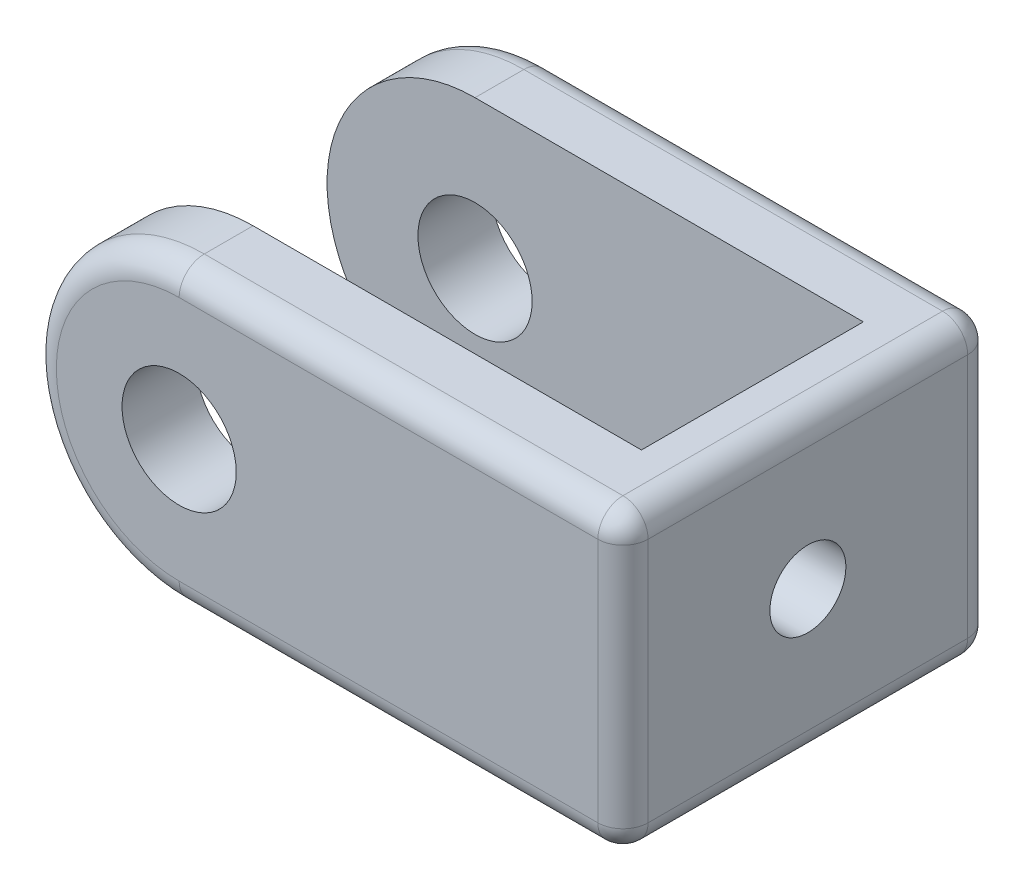
ISO-10303-21;
HEADER;
FILE_DESCRIPTION(('STEP AP214'),'2;1');
FILE_NAME('part.step','',(''),(''),'','','');
FILE_SCHEMA(('AUTOMOTIVE_DESIGN { 1 0 10303 214 1 1 1 1 }'));
ENDSEC;
DATA;
#1=APPLICATION_CONTEXT('core data for automotive mechanical design processes');
#2=APPLICATION_PROTOCOL_DEFINITION('international standard','automotive_design',2000,#1);
#3=PRODUCT_CONTEXT('',#1,'mechanical');
#4=PRODUCT('Part','Part','',(#3));
#5=PRODUCT_RELATED_PRODUCT_CATEGORY('part','',(#4));
#6=PRODUCT_DEFINITION_FORMATION('','',#4);
#7=PRODUCT_DEFINITION_CONTEXT('part definition',#1,'design');
#8=PRODUCT_DEFINITION('design','',#6,#7);
#9=PRODUCT_DEFINITION_SHAPE('','',#8);
#10=(LENGTH_UNIT() NAMED_UNIT(*) SI_UNIT(.MILLI.,.METRE.));
#11=(NAMED_UNIT(*) PLANE_ANGLE_UNIT() SI_UNIT($,.RADIAN.));
#12=(NAMED_UNIT(*) SI_UNIT($,.STERADIAN.) SOLID_ANGLE_UNIT());
#13=UNCERTAINTY_MEASURE_WITH_UNIT(LENGTH_MEASURE(1.E-05),#10,'distance_accuracy_value','');
#14=(GEOMETRIC_REPRESENTATION_CONTEXT(3) GLOBAL_UNCERTAINTY_ASSIGNED_CONTEXT((#13)) GLOBAL_UNIT_ASSIGNED_CONTEXT((#10,
#11,#12)) REPRESENTATION_CONTEXT('',''));
#15=CARTESIAN_POINT('',(0.,0.,0.));
#16=DIRECTION('',(0.,0.,1.));
#17=DIRECTION('',(1.,0.,0.));
#18=AXIS2_PLACEMENT_3D('',#15,#16,#17);
#19=CARTESIAN_POINT('',(-19.05,0.,15.875));
#20=DIRECTION('',(0.,0.,-1.));
#21=DIRECTION('',(-1.,0.,0.));
#22=AXIS2_PLACEMENT_3D('',#19,#20,#21);
#23=CYLINDRICAL_SURFACE('',#22,12.7);
#24=DIRECTION('',(0.,0.,-1.));
#25=VECTOR('',#24,1.);
#26=CARTESIAN_POINT('',(-19.05,12.7,15.875));
#27=LINE('',#26,#25);
#28=CARTESIAN_POINT('',(-19.05,12.7,-9.525));
#29=VERTEX_POINT('',#28);
#30=CARTESIAN_POINT('',(-19.05,12.7,-13.716));
#31=VERTEX_POINT('',#30);
#32=EDGE_CURVE('E185',#29,#31,#27,.T.);
#33=ORIENTED_EDGE('',*,*,#32,.T.);
#34=CARTESIAN_POINT('',(-19.05,0.,-13.716));
#35=DIRECTION('',(0.,0.,-1.));
#36=DIRECTION('',(-1.,0.,0.));
#37=AXIS2_PLACEMENT_3D('',#34,#35,#36);
#38=CIRCLE('',#37,12.7);
#39=CARTESIAN_POINT('',(-19.05,-12.7,-13.716));
#40=VERTEX_POINT('',#39);
#41=EDGE_CURVE('E212',#31,#40,#38,.F.);
#42=ORIENTED_EDGE('',*,*,#41,.T.);
#43=DIRECTION('',(0.,0.,-1.));
#44=VECTOR('',#43,1.);
#45=CARTESIAN_POINT('',(-19.05,-12.7,15.875));
#46=LINE('',#45,#44);
#47=CARTESIAN_POINT('',(-19.05,-12.7,-9.525));
#48=VERTEX_POINT('',#47);
#49=EDGE_CURVE('E190',#48,#40,#46,.T.);
#50=ORIENTED_EDGE('',*,*,#49,.F.);
#51=CARTESIAN_POINT('',(-19.05,0.,-9.525));
#52=DIRECTION('',(0.,0.,-1.));
#53=DIRECTION('',(-1.,0.,0.));
#54=AXIS2_PLACEMENT_3D('',#51,#52,#53);
#55=CIRCLE('',#54,12.7);
#56=EDGE_CURVE('E179',#48,#29,#55,.T.);
#57=ORIENTED_EDGE('',*,*,#56,.T.);
#58=EDGE_LOOP('',(#33,#42,#50,#57));
#59=FACE_BOUND('',#58,.T.);
#60=ADVANCED_FACE('F35',(#59),#23,.T.);
#61=CARTESIAN_POINT('',(-19.05,0.,-15.875));
#62=DIRECTION('',(0.,0.,1.));
#63=DIRECTION('',(1.,0.,0.));
#64=AXIS2_PLACEMENT_3D('',#61,#62,#63);
#65=CYLINDRICAL_SURFACE('',#64,4.9022);
#66=CARTESIAN_POINT('',(-19.05,0.,-9.525));
#67=DIRECTION('',(0.,0.,-1.));
#68=DIRECTION('',(-1.,0.,0.));
#69=AXIS2_PLACEMENT_3D('',#66,#67,#68);
#70=CIRCLE('',#69,4.9022);
#71=CARTESIAN_POINT('',(-23.9522,0.,-9.525));
#72=VERTEX_POINT('',#71);
#73=EDGE_CURVE('E178',#72,#72,#70,.F.);
#74=ORIENTED_EDGE('',*,*,#73,.T.);
#75=EDGE_LOOP('',(#74));
#76=FACE_BOUND('',#75,.T.);
#77=CARTESIAN_POINT('',(-19.05,0.,-15.875));
#78=DIRECTION('',(0.,0.,1.));
#79=DIRECTION('',(1.,0.,0.));
#80=AXIS2_PLACEMENT_3D('',#77,#78,#79);
#81=CIRCLE('',#80,4.9022);
#82=CARTESIAN_POINT('',(-14.1478,0.,-15.875));
#83=VERTEX_POINT('',#82);
#84=EDGE_CURVE('E182',#83,#83,#81,.T.);
#85=ORIENTED_EDGE('',*,*,#84,.F.);
#86=EDGE_LOOP('',(#85));
#87=FACE_BOUND('',#86,.T.);
#88=ADVANCED_FACE('F304',(#76,#87),#65,.F.);
#89=CARTESIAN_POINT('',(-19.05,-12.7,13.716));
#90=VERTEX_POINT('',#89);
#91=CARTESIAN_POINT('',(-19.05,-12.7,9.525));
#92=VERTEX_POINT('',#91);
#93=EDGE_CURVE('E160',#90,#92,#46,.T.);
#94=ORIENTED_EDGE('',*,*,#93,.F.);
#95=CARTESIAN_POINT('',(-19.05,0.,13.716));
#96=DIRECTION('',(0.,0.,-1.));
#97=DIRECTION('',(-1.,0.,0.));
#98=AXIS2_PLACEMENT_3D('',#95,#96,#97);
#99=CIRCLE('',#98,12.7);
#100=CARTESIAN_POINT('',(-19.05,12.7,13.716));
#101=VERTEX_POINT('',#100);
#102=EDGE_CURVE('E223',#90,#101,#99,.T.);
#103=ORIENTED_EDGE('',*,*,#102,.T.);
#104=CARTESIAN_POINT('',(-19.05,12.7,9.525));
#105=VERTEX_POINT('',#104);
#106=EDGE_CURVE('E188',#101,#105,#27,.T.);
#107=ORIENTED_EDGE('',*,*,#106,.T.);
#108=CARTESIAN_POINT('',(-19.05,0.,9.525));
#109=DIRECTION('',(0.,0.,1.));
#110=DIRECTION('',(1.,0.,0.));
#111=AXIS2_PLACEMENT_3D('',#108,#109,#110);
#112=CIRCLE('',#111,12.7);
#113=EDGE_CURVE('E176',#105,#92,#112,.T.);
#114=ORIENTED_EDGE('',*,*,#113,.T.);
#115=EDGE_LOOP('',(#94,#103,#107,#114));
#116=FACE_BOUND('',#115,.T.);
#117=ADVANCED_FACE('F307',(#116),#23,.T.);
#118=CARTESIAN_POINT('',(19.05,-12.7,15.875));
#119=DIRECTION('',(0.,1.,0.));
#120=DIRECTION('',(0.,0.,1.));
#121=AXIS2_PLACEMENT_3D('',#118,#119,#120);
#122=PLANE('',#121);
#123=ORIENTED_EDGE('',*,*,#49,.T.);
#124=DIRECTION('',(1.,0.,0.));
#125=VECTOR('',#124,1.);
#126=CARTESIAN_POINT('',(19.05,-12.7,-13.716));
#127=LINE('',#126,#125);
#128=CARTESIAN_POINT('',(16.891,-12.7,-13.716));
#129=VERTEX_POINT('',#128);
#130=EDGE_CURVE('E200',#40,#129,#127,.T.);
#131=ORIENTED_EDGE('',*,*,#130,.T.);
#132=DIRECTION('',(0.,0.,-1.));
#133=VECTOR('',#132,1.);
#134=CARTESIAN_POINT('',(16.891,-12.7,15.875));
#135=LINE('',#134,#133);
#136=CARTESIAN_POINT('',(16.891,-12.7,13.716));
#137=VERTEX_POINT('',#136);
#138=EDGE_CURVE('E192',#129,#137,#135,.F.);
#139=ORIENTED_EDGE('',*,*,#138,.T.);
#140=DIRECTION('',(1.,0.,0.));
#141=VECTOR('',#140,1.);
#142=CARTESIAN_POINT('',(19.05,-12.7,13.716));
#143=LINE('',#142,#141);
#144=EDGE_CURVE('E198',#137,#90,#143,.F.);
#145=ORIENTED_EDGE('',*,*,#144,.T.);
#146=ORIENTED_EDGE('',*,*,#93,.T.);
#147=DIRECTION('',(1.,0.,0.));
#148=VECTOR('',#147,1.);
#149=CARTESIAN_POINT('',(-31.75,-12.7,9.525));
#150=LINE('',#149,#148);
#151=CARTESIAN_POINT('',(14.2875,-12.7,9.525));
#152=VERTEX_POINT('',#151);
#153=EDGE_CURVE('E141',#92,#152,#150,.T.);
#154=ORIENTED_EDGE('',*,*,#153,.T.);
#155=DIRECTION('',(0.,0.,-1.));
#156=VECTOR('',#155,1.);
#157=CARTESIAN_POINT('',(14.2875,-12.7,-9.525));
#158=LINE('',#157,#156);
#159=CARTESIAN_POINT('',(14.2875,-12.7,-9.525));
#160=VERTEX_POINT('',#159);
#161=EDGE_CURVE('E151',#152,#160,#158,.T.);
#162=ORIENTED_EDGE('',*,*,#161,.T.);
#163=DIRECTION('',(-1.,0.,0.));
#164=VECTOR('',#163,1.);
#165=CARTESIAN_POINT('',(-31.75,-12.7,-9.525));
#166=LINE('',#165,#164);
#167=EDGE_CURVE('E148',#160,#48,#166,.T.);
#168=ORIENTED_EDGE('',*,*,#167,.T.);
#169=EDGE_LOOP('',(#123,#131,#139,#145,#146,#154,#162,#168));
#170=FACE_BOUND('',#169,.T.);
#171=ADVANCED_FACE('F158',(#170),#122,.F.);
#172=CARTESIAN_POINT('',(19.05,12.7,15.875));
#173=DIRECTION('',(-1.,0.,0.));
#174=DIRECTION('',(0.,0.,1.));
#175=AXIS2_PLACEMENT_3D('',#172,#173,#174);
#176=PLANE('',#175);
#177=DIRECTION('',(0.,0.,-1.));
#178=VECTOR('',#177,1.);
#179=CARTESIAN_POINT('',(19.05,-10.541,15.875));
#180=LINE('',#179,#178);
#181=CARTESIAN_POINT('',(19.05,-10.541,13.716));
#182=VERTEX_POINT('',#181);
#183=CARTESIAN_POINT('',(19.05,-10.541,-13.716));
#184=VERTEX_POINT('',#183);
#185=EDGE_CURVE('E44',#182,#184,#180,.T.);
#186=ORIENTED_EDGE('',*,*,#185,.T.);
#187=DIRECTION('',(0.,1.,0.));
#188=VECTOR('',#187,1.);
#189=CARTESIAN_POINT('',(19.05,12.7,-13.716));
#190=LINE('',#189,#188);
#191=CARTESIAN_POINT('',(19.05,10.541,-13.716));
#192=VERTEX_POINT('',#191);
#193=EDGE_CURVE('E11',#184,#192,#190,.T.);
#194=ORIENTED_EDGE('',*,*,#193,.T.);
#195=DIRECTION('',(0.,0.,-1.));
#196=VECTOR('',#195,1.);
#197=CARTESIAN_POINT('',(19.05,10.541,15.875));
#198=LINE('',#197,#196);
#199=CARTESIAN_POINT('',(19.05,10.541,13.716));
#200=VERTEX_POINT('',#199);
#201=EDGE_CURVE('E231',#192,#200,#198,.F.);
#202=ORIENTED_EDGE('',*,*,#201,.T.);
#203=DIRECTION('',(0.,1.,0.));
#204=VECTOR('',#203,1.);
#205=CARTESIAN_POINT('',(19.05,12.7,13.716));
#206=LINE('',#205,#204);
#207=EDGE_CURVE('E55',#200,#182,#206,.F.);
#208=ORIENTED_EDGE('',*,*,#207,.T.);
#209=EDGE_LOOP('',(#186,#194,#202,#208));
#210=FACE_BOUND('',#209,.T.);
#211=CARTESIAN_POINT('',(19.05,0.,0.));
#212=DIRECTION('',(1.,0.,0.));
#213=DIRECTION('',(0.,0.,-1.));
#214=AXIS2_PLACEMENT_3D('',#211,#212,#213);
#215=CIRCLE('',#214,3.2639);
#216=CARTESIAN_POINT('',(19.05,0.,-3.2639));
#217=VERTEX_POINT('',#216);
#218=EDGE_CURVE('E279',#217,#217,#215,.T.);
#219=ORIENTED_EDGE('',*,*,#218,.F.);
#220=EDGE_LOOP('',(#219));
#221=FACE_BOUND('',#220,.T.);
#222=ADVANCED_FACE('F323',(#210,#221),#176,.F.);
#223=CARTESIAN_POINT('',(-19.05,12.7,15.875));
#224=DIRECTION('',(0.,-1.,0.));
#225=DIRECTION('',(0.,0.,-1.));
#226=AXIS2_PLACEMENT_3D('',#223,#224,#225);
#227=PLANE('',#226);
#228=DIRECTION('',(0.,0.,-1.));
#229=VECTOR('',#228,1.);
#230=CARTESIAN_POINT('',(16.891,12.7,15.875));
#231=LINE('',#230,#229);
#232=CARTESIAN_POINT('',(16.891,12.7,13.716));
#233=VERTEX_POINT('',#232);
#234=CARTESIAN_POINT('',(16.891,12.7,-13.716));
#235=VERTEX_POINT('',#234);
#236=EDGE_CURVE('E225',#233,#235,#231,.T.);
#237=ORIENTED_EDGE('',*,*,#236,.T.);
#238=DIRECTION('',(-1.,0.,0.));
#239=VECTOR('',#238,1.);
#240=CARTESIAN_POINT('',(-19.05,12.7,-13.716));
#241=LINE('',#240,#239);
#242=EDGE_CURVE('E229',#235,#31,#241,.T.);
#243=ORIENTED_EDGE('',*,*,#242,.T.);
#244=ORIENTED_EDGE('',*,*,#32,.F.);
#245=DIRECTION('',(-1.,0.,0.));
#246=VECTOR('',#245,1.);
#247=CARTESIAN_POINT('',(-31.75,12.7,-9.525));
#248=LINE('',#247,#246);
#249=CARTESIAN_POINT('',(14.2875,12.7,-9.525));
#250=VERTEX_POINT('',#249);
#251=EDGE_CURVE('E162',#250,#29,#248,.T.);
#252=ORIENTED_EDGE('',*,*,#251,.F.);
#253=DIRECTION('',(0.,0.,-1.));
#254=VECTOR('',#253,1.);
#255=CARTESIAN_POINT('',(14.2875,12.7,-9.525));
#256=LINE('',#255,#254);
#257=CARTESIAN_POINT('',(14.2875,12.7,9.525));
#258=VERTEX_POINT('',#257);
#259=EDGE_CURVE('E165',#258,#250,#256,.T.);
#260=ORIENTED_EDGE('',*,*,#259,.F.);
#261=DIRECTION('',(1.,0.,0.));
#262=VECTOR('',#261,1.);
#263=CARTESIAN_POINT('',(-31.75,12.7,9.525));
#264=LINE('',#263,#262);
#265=EDGE_CURVE('E143',#105,#258,#264,.T.);
#266=ORIENTED_EDGE('',*,*,#265,.F.);
#267=ORIENTED_EDGE('',*,*,#106,.F.);
#268=DIRECTION('',(-1.,0.,0.));
#269=VECTOR('',#268,1.);
#270=CARTESIAN_POINT('',(-19.05,12.7,13.716));
#271=LINE('',#270,#269);
#272=EDGE_CURVE('E227',#101,#233,#271,.F.);
#273=ORIENTED_EDGE('',*,*,#272,.T.);
#274=EDGE_LOOP('',(#237,#243,#244,#252,#260,#266,#267,#273));
#275=FACE_BOUND('',#274,.T.);
#276=ADVANCED_FACE('F340',(#275),#227,.F.);
#277=CARTESIAN_POINT('',(-19.05,0.,15.875));
#278=DIRECTION('',(0.,0.,-1.));
#279=DIRECTION('',(-1.,0.,0.));
#280=AXIS2_PLACEMENT_3D('',#277,#278,#279);
#281=PLANE('',#280);
#282=CARTESIAN_POINT('',(-19.05,0.,15.875));
#283=DIRECTION('',(0.,0.,-1.));
#284=DIRECTION('',(-1.,0.,0.));
#285=AXIS2_PLACEMENT_3D('',#282,#283,#284);
#286=CIRCLE('',#285,10.541);
#287=CARTESIAN_POINT('',(-19.05,10.541,15.875));
#288=VERTEX_POINT('',#287);
#289=CARTESIAN_POINT('',(-19.05,-10.541,15.875));
#290=VERTEX_POINT('',#289);
#291=EDGE_CURVE('E218',#288,#290,#286,.F.);
#292=ORIENTED_EDGE('',*,*,#291,.T.);
#293=DIRECTION('',(1.,0.,0.));
#294=VECTOR('',#293,1.);
#295=CARTESIAN_POINT('',(-19.05,-10.541,15.875));
#296=LINE('',#295,#294);
#297=CARTESIAN_POINT('',(16.891,-10.541,15.875));
#298=VERTEX_POINT('',#297);
#299=EDGE_CURVE('E220',#290,#298,#296,.T.);
#300=ORIENTED_EDGE('',*,*,#299,.T.);
#301=DIRECTION('',(0.,1.,0.));
#302=VECTOR('',#301,1.);
#303=CARTESIAN_POINT('',(16.891,0.,15.875));
#304=LINE('',#303,#302);
#305=CARTESIAN_POINT('',(16.891,10.541,15.875));
#306=VERTEX_POINT('',#305);
#307=EDGE_CURVE('E214',#298,#306,#304,.T.);
#308=ORIENTED_EDGE('',*,*,#307,.T.);
#309=DIRECTION('',(-1.,0.,0.));
#310=VECTOR('',#309,1.);
#311=CARTESIAN_POINT('',(-19.05,10.541,15.875));
#312=LINE('',#311,#310);
#313=EDGE_CURVE('E216',#306,#288,#312,.T.);
#314=ORIENTED_EDGE('',*,*,#313,.T.);
#315=EDGE_LOOP('',(#292,#300,#308,#314));
#316=FACE_BOUND('',#315,.T.);
#317=CARTESIAN_POINT('',(-19.05,0.,15.875));
#318=DIRECTION('',(0.,0.,1.));
#319=DIRECTION('',(1.,0.,0.));
#320=AXIS2_PLACEMENT_3D('',#317,#318,#319);
#321=CIRCLE('',#320,4.9022);
#322=CARTESIAN_POINT('',(-14.1478,0.,15.875));
#323=VERTEX_POINT('',#322);
#324=EDGE_CURVE('E181',#323,#323,#321,.T.);
#325=ORIENTED_EDGE('',*,*,#324,.F.);
#326=EDGE_LOOP('',(#325));
#327=FACE_BOUND('',#326,.T.);
#328=ADVANCED_FACE('F334',(#316,#327),#281,.F.);
#329=CARTESIAN_POINT('',(-19.05,0.,-15.875));
#330=DIRECTION('',(0.,0.,-1.));
#331=DIRECTION('',(-1.,0.,0.));
#332=AXIS2_PLACEMENT_3D('',#329,#330,#331);
#333=PLANE('',#332);
#334=DIRECTION('',(0.,1.,0.));
#335=VECTOR('',#334,1.);
#336=CARTESIAN_POINT('',(16.891,-12.7,-15.875));
#337=LINE('',#336,#335);
#338=CARTESIAN_POINT('',(16.891,10.541,-15.875));
#339=VERTEX_POINT('',#338);
#340=CARTESIAN_POINT('',(16.891,-10.541,-15.875));
#341=VERTEX_POINT('',#340);
#342=EDGE_CURVE('E203',#339,#341,#337,.F.);
#343=ORIENTED_EDGE('',*,*,#342,.T.);
#344=DIRECTION('',(1.,0.,0.));
#345=VECTOR('',#344,1.);
#346=CARTESIAN_POINT('',(-19.05,-10.541,-15.875));
#347=LINE('',#346,#345);
#348=CARTESIAN_POINT('',(-19.05,-10.541,-15.875));
#349=VERTEX_POINT('',#348);
#350=EDGE_CURVE('E209',#341,#349,#347,.F.);
#351=ORIENTED_EDGE('',*,*,#350,.T.);
#352=CARTESIAN_POINT('',(-19.05,0.,-15.875));
#353=DIRECTION('',(0.,0.,-1.));
#354=DIRECTION('',(-1.,0.,0.));
#355=AXIS2_PLACEMENT_3D('',#352,#353,#354);
#356=CIRCLE('',#355,10.541);
#357=CARTESIAN_POINT('',(-19.05,10.541,-15.875));
#358=VERTEX_POINT('',#357);
#359=EDGE_CURVE('E207',#349,#358,#356,.T.);
#360=ORIENTED_EDGE('',*,*,#359,.T.);
#361=DIRECTION('',(-1.,0.,0.));
#362=VECTOR('',#361,1.);
#363=CARTESIAN_POINT('',(19.05,10.541,-15.875));
#364=LINE('',#363,#362);
#365=EDGE_CURVE('E205',#358,#339,#364,.F.);
#366=ORIENTED_EDGE('',*,*,#365,.T.);
#367=EDGE_LOOP('',(#343,#351,#360,#366));
#368=FACE_BOUND('',#367,.T.);
#369=ORIENTED_EDGE('',*,*,#84,.T.);
#370=EDGE_LOOP('',(#369));
#371=FACE_BOUND('',#370,.T.);
#372=ADVANCED_FACE('F381',(#368,#371),#333,.T.);
#373=CARTESIAN_POINT('',(-19.05,0.,9.525));
#374=DIRECTION('',(0.,0.,1.));
#375=DIRECTION('',(1.,0.,0.));
#376=AXIS2_PLACEMENT_3D('',#373,#374,#375);
#377=CIRCLE('',#376,4.9022);
#378=CARTESIAN_POINT('',(-14.1478,0.,9.525));
#379=VERTEX_POINT('',#378);
#380=EDGE_CURVE('E174',#379,#379,#377,.F.);
#381=ORIENTED_EDGE('',*,*,#380,.T.);
#382=EDGE_LOOP('',(#381));
#383=FACE_BOUND('',#382,.T.);
#384=ORIENTED_EDGE('',*,*,#324,.T.);
#385=EDGE_LOOP('',(#384));
#386=FACE_BOUND('',#385,.T.);
#387=ADVANCED_FACE('F315',(#383,#386),#65,.F.);
#388=CARTESIAN_POINT('',(-31.75,-12.7,-9.525));
#389=DIRECTION('',(0.,0.,-1.));
#390=DIRECTION('',(-1.,0.,0.));
#391=AXIS2_PLACEMENT_3D('',#388,#389,#390);
#392=PLANE('',#391);
#393=ORIENTED_EDGE('',*,*,#73,.F.);
#394=EDGE_LOOP('',(#393));
#395=FACE_BOUND('',#394,.T.);
#396=ORIENTED_EDGE('',*,*,#56,.F.);
#397=ORIENTED_EDGE('',*,*,#167,.F.);
#398=DIRECTION('',(0.,1.,0.));
#399=VECTOR('',#398,1.);
#400=CARTESIAN_POINT('',(14.2875,-12.7,-9.525));
#401=LINE('',#400,#399);
#402=EDGE_CURVE('E147',#160,#250,#401,.T.);
#403=ORIENTED_EDGE('',*,*,#402,.T.);
#404=ORIENTED_EDGE('',*,*,#251,.T.);
#405=EDGE_LOOP('',(#396,#397,#403,#404));
#406=FACE_BOUND('',#405,.T.);
#407=ADVANCED_FACE('F299',(#395,#406),#392,.F.);
#408=CARTESIAN_POINT('',(-31.75,-12.7,9.525));
#409=DIRECTION('',(0.,0.,1.));
#410=DIRECTION('',(1.,0.,0.));
#411=AXIS2_PLACEMENT_3D('',#408,#409,#410);
#412=PLANE('',#411);
#413=ORIENTED_EDGE('',*,*,#380,.F.);
#414=EDGE_LOOP('',(#413));
#415=FACE_BOUND('',#414,.T.);
#416=ORIENTED_EDGE('',*,*,#265,.T.);
#417=DIRECTION('',(0.,1.,0.));
#418=VECTOR('',#417,1.);
#419=CARTESIAN_POINT('',(14.2875,-12.7,9.525));
#420=LINE('',#419,#418);
#421=EDGE_CURVE('E136',#152,#258,#420,.T.);
#422=ORIENTED_EDGE('',*,*,#421,.F.);
#423=ORIENTED_EDGE('',*,*,#153,.F.);
#424=ORIENTED_EDGE('',*,*,#113,.F.);
#425=EDGE_LOOP('',(#416,#422,#423,#424));
#426=FACE_BOUND('',#425,.T.);
#427=ADVANCED_FACE('F138',(#415,#426),#412,.F.);
#428=CARTESIAN_POINT('',(14.2875,-12.7,-9.525));
#429=DIRECTION('',(1.,0.,0.));
#430=DIRECTION('',(0.,0.,-1.));
#431=AXIS2_PLACEMENT_3D('',#428,#429,#430);
#432=PLANE('',#431);
#433=CARTESIAN_POINT('',(14.2875,0.,0.));
#434=DIRECTION('',(1.,0.,0.));
#435=DIRECTION('',(0.,0.,-1.));
#436=AXIS2_PLACEMENT_3D('',#433,#434,#435);
#437=CIRCLE('',#436,3.2639);
#438=CARTESIAN_POINT('',(14.2875,0.,-3.2639));
#439=VERTEX_POINT('',#438);
#440=EDGE_CURVE('E168',#439,#439,#437,.F.);
#441=ORIENTED_EDGE('',*,*,#440,.F.);
#442=EDGE_LOOP('',(#441));
#443=FACE_BOUND('',#442,.T.);
#444=ORIENTED_EDGE('',*,*,#259,.T.);
#445=ORIENTED_EDGE('',*,*,#402,.F.);
#446=ORIENTED_EDGE('',*,*,#161,.F.);
#447=ORIENTED_EDGE('',*,*,#421,.T.);
#448=EDGE_LOOP('',(#444,#445,#446,#447));
#449=FACE_BOUND('',#448,.T.);
#450=ADVANCED_FACE('F152',(#443,#449),#432,.F.);
#451=CARTESIAN_POINT('',(5.05579670754091,0.,0.));
#452=DIRECTION('',(1.,0.,0.));
#453=DIRECTION('',(0.,0.,-1.));
#454=AXIS2_PLACEMENT_3D('',#451,#452,#453);
#455=CYLINDRICAL_SURFACE('',#454,3.2639);
#456=ORIENTED_EDGE('',*,*,#440,.T.);
#457=EDGE_LOOP('',(#456));
#458=FACE_BOUND('',#457,.T.);
#459=ORIENTED_EDGE('',*,*,#218,.T.);
#460=EDGE_LOOP('',(#459));
#461=FACE_BOUND('',#460,.T.);
#462=ADVANCED_FACE('F290',(#458,#461),#455,.F.);
#463=CARTESIAN_POINT('',(-19.05,10.541,13.716));
#464=DIRECTION('',(-1.,0.,0.));
#465=DIRECTION('',(0.,0.,1.));
#466=AXIS2_PLACEMENT_3D('',#463,#464,#465);
#467=CYLINDRICAL_SURFACE('',#466,2.159);
#468=CARTESIAN_POINT('',(16.891,10.541,13.716));
#469=DIRECTION('',(1.,0.,0.));
#470=DIRECTION('',(0.,0.,-1.));
#471=AXIS2_PLACEMENT_3D('',#468,#469,#470);
#472=CIRCLE('',#471,2.159);
#473=EDGE_CURVE('E272',#233,#306,#472,.T.);
#474=ORIENTED_EDGE('',*,*,#473,.F.);
#475=ORIENTED_EDGE('',*,*,#272,.F.);
#476=CARTESIAN_POINT('',(-19.05,10.541,13.716));
#477=DIRECTION('',(-1.,0.,0.));
#478=DIRECTION('',(0.,0.,1.));
#479=AXIS2_PLACEMENT_3D('',#476,#477,#478);
#480=CIRCLE('',#479,2.159);
#481=EDGE_CURVE('E39',#288,#101,#480,.T.);
#482=ORIENTED_EDGE('',*,*,#481,.F.);
#483=ORIENTED_EDGE('',*,*,#313,.F.);
#484=EDGE_LOOP('',(#474,#475,#482,#483));
#485=FACE_BOUND('',#484,.T.);
#486=ADVANCED_FACE('F37',(#485),#467,.T.);
#487=CARTESIAN_POINT('',(-19.05,0.,13.716));
#488=DIRECTION('',(0.,0.,-1.));
#489=DIRECTION('',(-1.,0.,0.));
#490=AXIS2_PLACEMENT_3D('',#487,#488,#489);
#491=TOROIDAL_SURFACE('',#490,10.541,2.159);
#492=ORIENTED_EDGE('',*,*,#481,.T.);
#493=ORIENTED_EDGE('',*,*,#102,.F.);
#494=CARTESIAN_POINT('',(-19.05,-10.541,13.716));
#495=DIRECTION('',(1.,0.,0.));
#496=DIRECTION('',(0.,0.,-1.));
#497=AXIS2_PLACEMENT_3D('',#494,#495,#496);
#498=CIRCLE('',#497,2.159);
#499=EDGE_CURVE('E270',#290,#90,#498,.T.);
#500=ORIENTED_EDGE('',*,*,#499,.F.);
#501=ORIENTED_EDGE('',*,*,#291,.F.);
#502=EDGE_LOOP('',(#492,#493,#500,#501));
#503=FACE_BOUND('',#502,.T.);
#504=ADVANCED_FACE('F326',(#503),#491,.T.);
#505=CARTESIAN_POINT('',(16.891,10.541,13.716));
#506=DIRECTION('',(0.,0.,1.));
#507=DIRECTION('',(1.,0.,0.));
#508=AXIS2_PLACEMENT_3D('',#505,#506,#507);
#509=SPHERICAL_SURFACE('',#508,2.159);
#510=CARTESIAN_POINT('',(16.891,10.541,13.716));
#511=DIRECTION('',(0.,0.,1.));
#512=DIRECTION('',(1.,0.,0.));
#513=AXIS2_PLACEMENT_3D('',#510,#511,#512);
#514=CIRCLE('',#513,2.159);
#515=EDGE_CURVE('E264',#233,#200,#514,.F.);
#516=ORIENTED_EDGE('',*,*,#515,.F.);
#517=ORIENTED_EDGE('',*,*,#473,.T.);
#518=CARTESIAN_POINT('',(16.891,10.541,13.716));
#519=DIRECTION('',(0.,1.,0.));
#520=DIRECTION('',(0.,0.,1.));
#521=AXIS2_PLACEMENT_3D('',#518,#519,#520);
#522=CIRCLE('',#521,2.159);
#523=EDGE_CURVE('E267',#200,#306,#522,.F.);
#524=ORIENTED_EDGE('',*,*,#523,.F.);
#525=EDGE_LOOP('',(#516,#517,#524));
#526=FACE_BOUND('',#525,.T.);
#527=ADVANCED_FACE('F367',(#526),#509,.T.);
#528=CARTESIAN_POINT('',(-19.05,-10.541,13.716));
#529=DIRECTION('',(1.,0.,0.));
#530=DIRECTION('',(0.,0.,-1.));
#531=AXIS2_PLACEMENT_3D('',#528,#529,#530);
#532=CYLINDRICAL_SURFACE('',#531,2.159);
#533=ORIENTED_EDGE('',*,*,#499,.T.);
#534=ORIENTED_EDGE('',*,*,#144,.F.);
#535=CARTESIAN_POINT('',(16.891,-10.541,13.716));
#536=DIRECTION('',(1.,0.,0.));
#537=DIRECTION('',(0.,0.,-1.));
#538=AXIS2_PLACEMENT_3D('',#535,#536,#537);
#539=CIRCLE('',#538,2.159);
#540=EDGE_CURVE('E261',#298,#137,#539,.T.);
#541=ORIENTED_EDGE('',*,*,#540,.F.);
#542=ORIENTED_EDGE('',*,*,#299,.F.);
#543=EDGE_LOOP('',(#533,#534,#541,#542));
#544=FACE_BOUND('',#543,.T.);
#545=ADVANCED_FACE('F330',(#544),#532,.T.);
#546=CARTESIAN_POINT('',(16.891,0.,13.716));
#547=DIRECTION('',(0.,1.,0.));
#548=DIRECTION('',(0.,0.,1.));
#549=AXIS2_PLACEMENT_3D('',#546,#547,#548);
#550=CYLINDRICAL_SURFACE('',#549,2.159);
#551=ORIENTED_EDGE('',*,*,#523,.T.);
#552=ORIENTED_EDGE('',*,*,#307,.F.);
#553=CARTESIAN_POINT('',(16.891,-10.541,13.716));
#554=DIRECTION('',(0.,-1.,0.));
#555=DIRECTION('',(0.,0.,-1.));
#556=AXIS2_PLACEMENT_3D('',#553,#554,#555);
#557=CIRCLE('',#556,2.159);
#558=EDGE_CURVE('E259',#182,#298,#557,.T.);
#559=ORIENTED_EDGE('',*,*,#558,.F.);
#560=ORIENTED_EDGE('',*,*,#207,.F.);
#561=EDGE_LOOP('',(#551,#552,#559,#560));
#562=FACE_BOUND('',#561,.T.);
#563=ADVANCED_FACE('F366',(#562),#550,.T.);
#564=CARTESIAN_POINT('',(16.891,10.541,15.875));
#565=DIRECTION('',(0.,0.,-1.));
#566=DIRECTION('',(-1.,0.,0.));
#567=AXIS2_PLACEMENT_3D('',#564,#565,#566);
#568=CYLINDRICAL_SURFACE('',#567,2.159);
#569=ORIENTED_EDGE('',*,*,#515,.T.);
#570=ORIENTED_EDGE('',*,*,#201,.F.);
#571=CARTESIAN_POINT('',(16.891,10.541,-13.716));
#572=DIRECTION('',(0.,0.,-1.));
#573=DIRECTION('',(-1.,0.,0.));
#574=AXIS2_PLACEMENT_3D('',#571,#572,#573);
#575=CIRCLE('',#574,2.159);
#576=EDGE_CURVE('E256',#235,#192,#575,.T.);
#577=ORIENTED_EDGE('',*,*,#576,.F.);
#578=ORIENTED_EDGE('',*,*,#236,.F.);
#579=EDGE_LOOP('',(#569,#570,#577,#578));
#580=FACE_BOUND('',#579,.T.);
#581=ADVANCED_FACE('F370',(#580),#568,.T.);
#582=CARTESIAN_POINT('',(16.891,-10.541,13.716));
#583=DIRECTION('',(0.,0.,1.));
#584=DIRECTION('',(1.,0.,0.));
#585=AXIS2_PLACEMENT_3D('',#582,#583,#584);
#586=SPHERICAL_SURFACE('',#585,2.159);
#587=ORIENTED_EDGE('',*,*,#558,.T.);
#588=ORIENTED_EDGE('',*,*,#540,.T.);
#589=CARTESIAN_POINT('',(16.891,-10.541,13.716));
#590=DIRECTION('',(0.,0.,1.));
#591=DIRECTION('',(1.,0.,0.));
#592=AXIS2_PLACEMENT_3D('',#589,#590,#591);
#593=CIRCLE('',#592,2.159);
#594=EDGE_CURVE('E250',#182,#137,#593,.F.);
#595=ORIENTED_EDGE('',*,*,#594,.F.);
#596=EDGE_LOOP('',(#587,#588,#595));
#597=FACE_BOUND('',#596,.T.);
#598=ADVANCED_FACE('F364',(#597),#586,.T.);
#599=CARTESIAN_POINT('',(16.891,10.541,-13.716));
#600=DIRECTION('',(0.,0.,1.));
#601=DIRECTION('',(1.,0.,0.));
#602=AXIS2_PLACEMENT_3D('',#599,#600,#601);
#603=SPHERICAL_SURFACE('',#602,2.159);
#604=CARTESIAN_POINT('',(16.891,10.541,-13.716));
#605=DIRECTION('',(0.,1.,0.));
#606=DIRECTION('',(0.,0.,1.));
#607=AXIS2_PLACEMENT_3D('',#604,#605,#606);
#608=CIRCLE('',#607,2.159);
#609=EDGE_CURVE('E248',#339,#192,#608,.F.);
#610=ORIENTED_EDGE('',*,*,#609,.F.);
#611=CARTESIAN_POINT('',(16.891,10.541,-13.716));
#612=DIRECTION('',(1.,0.,0.));
#613=DIRECTION('',(0.,0.,-1.));
#614=AXIS2_PLACEMENT_3D('',#611,#612,#613);
#615=CIRCLE('',#614,2.159);
#616=EDGE_CURVE('E253',#235,#339,#615,.F.);
#617=ORIENTED_EDGE('',*,*,#616,.F.);
#618=ORIENTED_EDGE('',*,*,#576,.T.);
#619=EDGE_LOOP('',(#610,#617,#618));
#620=FACE_BOUND('',#619,.T.);
#621=ADVANCED_FACE('F375',(#620),#603,.T.);
#622=CARTESIAN_POINT('',(-19.05,10.541,-13.716));
#623=DIRECTION('',(1.,0.,0.));
#624=DIRECTION('',(0.,0.,-1.));
#625=AXIS2_PLACEMENT_3D('',#622,#623,#624);
#626=CYLINDRICAL_SURFACE('',#625,2.159);
#627=ORIENTED_EDGE('',*,*,#616,.T.);
#628=ORIENTED_EDGE('',*,*,#365,.F.);
#629=CARTESIAN_POINT('',(-19.05,10.541,-13.716));
#630=DIRECTION('',(-1.,0.,0.));
#631=DIRECTION('',(0.,0.,1.));
#632=AXIS2_PLACEMENT_3D('',#629,#630,#631);
#633=CIRCLE('',#632,2.159);
#634=EDGE_CURVE('E245',#31,#358,#633,.T.);
#635=ORIENTED_EDGE('',*,*,#634,.F.);
#636=ORIENTED_EDGE('',*,*,#242,.F.);
#637=EDGE_LOOP('',(#627,#628,#635,#636));
#638=FACE_BOUND('',#637,.T.);
#639=ADVANCED_FACE('F379',(#638),#626,.T.);
#640=CARTESIAN_POINT('',(16.891,-10.541,15.875));
#641=DIRECTION('',(0.,0.,-1.));
#642=DIRECTION('',(-1.,0.,0.));
#643=AXIS2_PLACEMENT_3D('',#640,#641,#642);
#644=CYLINDRICAL_SURFACE('',#643,2.159);
#645=ORIENTED_EDGE('',*,*,#594,.T.);
#646=ORIENTED_EDGE('',*,*,#138,.F.);
#647=CARTESIAN_POINT('',(16.891,-10.541,-13.716));
#648=DIRECTION('',(0.,0.,-1.));
#649=DIRECTION('',(-1.,0.,0.));
#650=AXIS2_PLACEMENT_3D('',#647,#648,#649);
#651=CIRCLE('',#650,2.159);
#652=EDGE_CURVE('E242',#184,#129,#651,.T.);
#653=ORIENTED_EDGE('',*,*,#652,.F.);
#654=ORIENTED_EDGE('',*,*,#185,.F.);
#655=EDGE_LOOP('',(#645,#646,#653,#654));
#656=FACE_BOUND('',#655,.T.);
#657=ADVANCED_FACE('F361',(#656),#644,.T.);
#658=CARTESIAN_POINT('',(16.891,12.7,-13.716));
#659=DIRECTION('',(0.,-1.,0.));
#660=DIRECTION('',(0.,0.,-1.));
#661=AXIS2_PLACEMENT_3D('',#658,#659,#660);
#662=CYLINDRICAL_SURFACE('',#661,2.159);
#663=ORIENTED_EDGE('',*,*,#609,.T.);
#664=ORIENTED_EDGE('',*,*,#193,.F.);
#665=CARTESIAN_POINT('',(16.891,-10.541,-13.716));
#666=DIRECTION('',(0.,-1.,0.));
#667=DIRECTION('',(1.,0.,0.));
#668=AXIS2_PLACEMENT_3D('',#665,#666,#667);
#669=CIRCLE('',#668,2.159);
#670=EDGE_CURVE('E239',#341,#184,#669,.T.);
#671=ORIENTED_EDGE('',*,*,#670,.F.);
#672=ORIENTED_EDGE('',*,*,#342,.F.);
#673=EDGE_LOOP('',(#663,#664,#671,#672));
#674=FACE_BOUND('',#673,.T.);
#675=ADVANCED_FACE('F387',(#674),#662,.T.);
#676=CARTESIAN_POINT('',(-19.05,0.,-13.716));
#677=DIRECTION('',(0.,0.,-1.));
#678=DIRECTION('',(-1.,0.,0.));
#679=AXIS2_PLACEMENT_3D('',#676,#677,#678);
#680=TOROIDAL_SURFACE('',#679,10.541,2.159);
#681=ORIENTED_EDGE('',*,*,#634,.T.);
#682=ORIENTED_EDGE('',*,*,#359,.F.);
#683=CARTESIAN_POINT('',(-19.05,-10.541,-13.716));
#684=DIRECTION('',(1.,0.,0.));
#685=DIRECTION('',(0.,0.,-1.));
#686=AXIS2_PLACEMENT_3D('',#683,#684,#685);
#687=CIRCLE('',#686,2.159);
#688=EDGE_CURVE('E237',#40,#349,#687,.T.);
#689=ORIENTED_EDGE('',*,*,#688,.F.);
#690=ORIENTED_EDGE('',*,*,#41,.F.);
#691=EDGE_LOOP('',(#681,#682,#689,#690));
#692=FACE_BOUND('',#691,.T.);
#693=ADVANCED_FACE('F351',(#692),#680,.T.);
#694=CARTESIAN_POINT('',(16.891,-10.541,-13.716));
#695=DIRECTION('',(0.,0.,1.));
#696=DIRECTION('',(1.,0.,0.));
#697=AXIS2_PLACEMENT_3D('',#694,#695,#696);
#698=SPHERICAL_SURFACE('',#697,2.159);
#699=ORIENTED_EDGE('',*,*,#670,.T.);
#700=ORIENTED_EDGE('',*,*,#652,.T.);
#701=CARTESIAN_POINT('',(16.891,-10.541,-13.716));
#702=DIRECTION('',(1.,0.,0.));
#703=DIRECTION('',(0.,0.,-1.));
#704=AXIS2_PLACEMENT_3D('',#701,#702,#703);
#705=CIRCLE('',#704,2.159);
#706=EDGE_CURVE('E235',#341,#129,#705,.F.);
#707=ORIENTED_EDGE('',*,*,#706,.F.);
#708=EDGE_LOOP('',(#699,#700,#707));
#709=FACE_BOUND('',#708,.T.);
#710=ADVANCED_FACE('F385',(#709),#698,.T.);
#711=CARTESIAN_POINT('',(19.05,-10.541,-13.716));
#712=DIRECTION('',(-1.,0.,0.));
#713=DIRECTION('',(0.,0.,1.));
#714=AXIS2_PLACEMENT_3D('',#711,#712,#713);
#715=CYLINDRICAL_SURFACE('',#714,2.159);
#716=ORIENTED_EDGE('',*,*,#688,.T.);
#717=ORIENTED_EDGE('',*,*,#350,.F.);
#718=ORIENTED_EDGE('',*,*,#706,.T.);
#719=ORIENTED_EDGE('',*,*,#130,.F.);
#720=EDGE_LOOP('',(#716,#717,#718,#719));
#721=FACE_BOUND('',#720,.T.);
#722=ADVANCED_FACE('F356',(#721),#715,.T.);
#723=CLOSED_SHELL('',(#60,#88,#117,#171,#222,#276,#328,#372,#387,#407,#427,#450,#462,#486,#504,
#527,#545,#563,#581,#598,#621,#639,#657,#675,#693,#710,#722));
#724=MANIFOLD_SOLID_BREP('B2',#723);
#725=ADVANCED_BREP_SHAPE_REPRESENTATION('',(#18,#724),#14);
#726=SHAPE_DEFINITION_REPRESENTATION(#9,#725);
ENDSEC;
END-ISO-10303-21;
